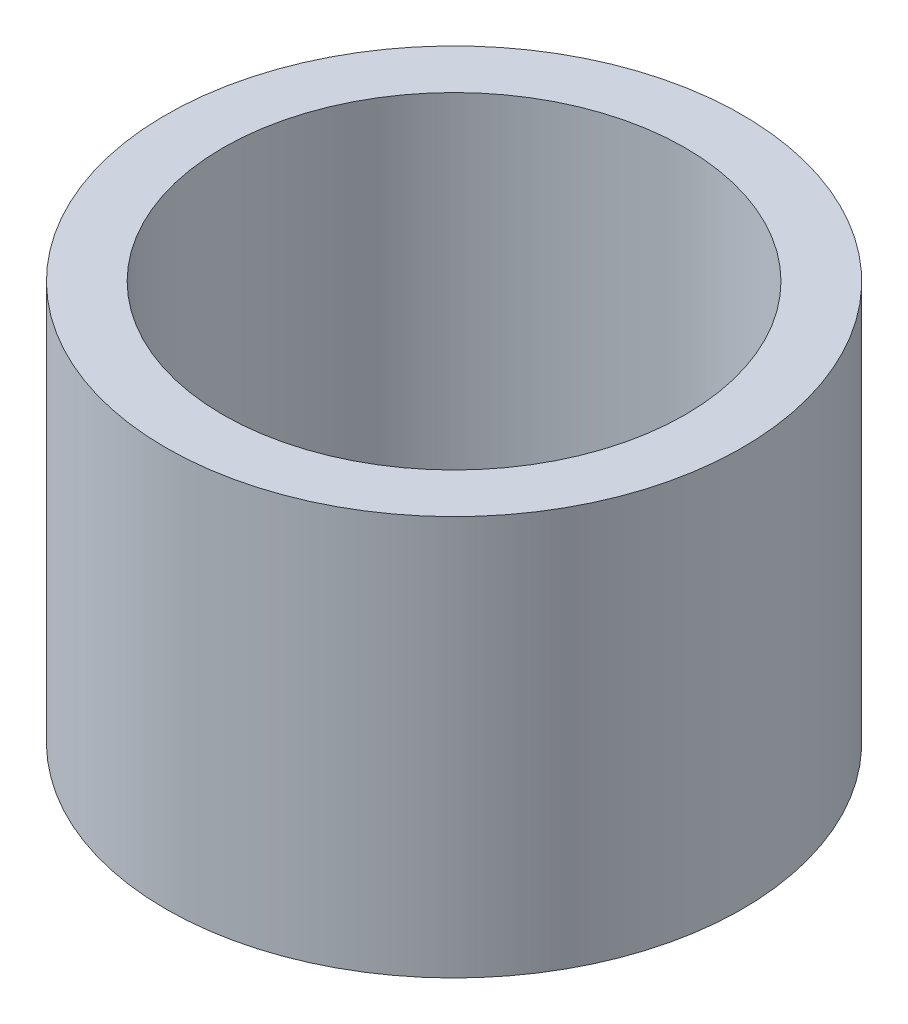
ISO-10303-21;
HEADER;
FILE_DESCRIPTION(('STEP AP214'),'2;1');
FILE_NAME('part.step','',(''),(''),'','','');
FILE_SCHEMA(('AUTOMOTIVE_DESIGN { 1 0 10303 214 1 1 1 1 }'));
ENDSEC;
DATA;
#1=APPLICATION_CONTEXT('core data for automotive mechanical design processes');
#2=APPLICATION_PROTOCOL_DEFINITION('international standard','automotive_design',2000,#1);
#3=PRODUCT_CONTEXT('',#1,'mechanical');
#4=PRODUCT('Part','Part','',(#3));
#5=PRODUCT_RELATED_PRODUCT_CATEGORY('part','',(#4));
#6=PRODUCT_DEFINITION_FORMATION('','',#4);
#7=PRODUCT_DEFINITION_CONTEXT('part definition',#1,'design');
#8=PRODUCT_DEFINITION('design','',#6,#7);
#9=PRODUCT_DEFINITION_SHAPE('','',#8);
#10=(LENGTH_UNIT() NAMED_UNIT(*) SI_UNIT(.MILLI.,.METRE.));
#11=(NAMED_UNIT(*) PLANE_ANGLE_UNIT() SI_UNIT($,.RADIAN.));
#12=(NAMED_UNIT(*) SI_UNIT($,.STERADIAN.) SOLID_ANGLE_UNIT());
#13=UNCERTAINTY_MEASURE_WITH_UNIT(LENGTH_MEASURE(1.E-05),#10,'distance_accuracy_value','');
#14=(GEOMETRIC_REPRESENTATION_CONTEXT(3) GLOBAL_UNCERTAINTY_ASSIGNED_CONTEXT((#13)) GLOBAL_UNIT_ASSIGNED_CONTEXT((#10,
#11,#12)) REPRESENTATION_CONTEXT('',''));
#15=CARTESIAN_POINT('',(0.,0.,0.));
#16=DIRECTION('',(0.,0.,1.));
#17=DIRECTION('',(1.,0.,0.));
#18=AXIS2_PLACEMENT_3D('',#15,#16,#17);
#19=CARTESIAN_POINT('',(0.,7.,0.));
#20=DIRECTION('',(0.,1.,0.));
#21=DIRECTION('',(0.,0.,1.));
#22=AXIS2_PLACEMENT_3D('',#19,#20,#21);
#23=PLANE('',#22);
#24=CARTESIAN_POINT('',(0.,7.,0.));
#25=DIRECTION('',(0.,1.,0.));
#26=DIRECTION('',(0.,0.,1.));
#27=AXIS2_PLACEMENT_3D('',#24,#25,#26);
#28=CIRCLE('',#27,5.05);
#29=CARTESIAN_POINT('',(0.,7.,5.05));
#30=VERTEX_POINT('',#29);
#31=EDGE_CURVE('E10',#30,#30,#28,.T.);
#32=ORIENTED_EDGE('',*,*,#31,.T.);
#33=EDGE_LOOP('',(#32));
#34=FACE_BOUND('',#33,.T.);
#35=CARTESIAN_POINT('',(0.,7.,0.));
#36=DIRECTION('',(0.,1.,0.));
#37=DIRECTION('',(0.,0.,1.));
#38=AXIS2_PLACEMENT_3D('',#35,#36,#37);
#39=CIRCLE('',#38,4.05);
#40=CARTESIAN_POINT('',(0.,7.,4.05));
#41=VERTEX_POINT('',#40);
#42=EDGE_CURVE('E56',#41,#41,#39,.T.);
#43=ORIENTED_EDGE('',*,*,#42,.F.);
#44=EDGE_LOOP('',(#43));
#45=FACE_BOUND('',#44,.T.);
#46=ADVANCED_FACE('F43',(#34,#45),#23,.T.);
#47=CARTESIAN_POINT('',(0.,0.,0.));
#48=DIRECTION('',(0.,1.,0.));
#49=DIRECTION('',(0.,0.,1.));
#50=AXIS2_PLACEMENT_3D('',#47,#48,#49);
#51=PLANE('',#50);
#52=CARTESIAN_POINT('',(0.,0.,0.));
#53=DIRECTION('',(0.,1.,0.));
#54=DIRECTION('',(0.,0.,1.));
#55=AXIS2_PLACEMENT_3D('',#52,#53,#54);
#56=CIRCLE('',#55,5.05);
#57=CARTESIAN_POINT('',(0.,0.,5.05));
#58=VERTEX_POINT('',#57);
#59=EDGE_CURVE('E47',#58,#58,#56,.T.);
#60=ORIENTED_EDGE('',*,*,#59,.F.);
#61=EDGE_LOOP('',(#60));
#62=FACE_BOUND('',#61,.T.);
#63=CARTESIAN_POINT('',(0.,0.,0.));
#64=DIRECTION('',(0.,1.,0.));
#65=DIRECTION('',(0.,0.,1.));
#66=AXIS2_PLACEMENT_3D('',#63,#64,#65);
#67=CIRCLE('',#66,4.05);
#68=CARTESIAN_POINT('',(0.,0.,4.05));
#69=VERTEX_POINT('',#68);
#70=EDGE_CURVE('E58',#69,#69,#67,.T.);
#71=ORIENTED_EDGE('',*,*,#70,.T.);
#72=EDGE_LOOP('',(#71));
#73=FACE_BOUND('',#72,.T.);
#74=ADVANCED_FACE('F70',(#62,#73),#51,.F.);
#75=CARTESIAN_POINT('',(0.,7.,0.));
#76=DIRECTION('',(0.,-1.,0.));
#77=DIRECTION('',(0.,0.,-1.));
#78=AXIS2_PLACEMENT_3D('',#75,#76,#77);
#79=CYLINDRICAL_SURFACE('',#78,5.05);
#80=ORIENTED_EDGE('',*,*,#31,.F.);
#81=EDGE_LOOP('',(#80));
#82=FACE_BOUND('',#81,.T.);
#83=ORIENTED_EDGE('',*,*,#59,.T.);
#84=EDGE_LOOP('',(#83));
#85=FACE_BOUND('',#84,.T.);
#86=ADVANCED_FACE('F45',(#82,#85),#79,.T.);
#87=CARTESIAN_POINT('',(0.,7.,0.));
#88=DIRECTION('',(0.,-1.,0.));
#89=DIRECTION('',(0.,0.,-1.));
#90=AXIS2_PLACEMENT_3D('',#87,#88,#89);
#91=CYLINDRICAL_SURFACE('',#90,4.05);
#92=ORIENTED_EDGE('',*,*,#42,.T.);
#93=EDGE_LOOP('',(#92));
#94=FACE_BOUND('',#93,.T.);
#95=ORIENTED_EDGE('',*,*,#70,.F.);
#96=EDGE_LOOP('',(#95));
#97=FACE_BOUND('',#96,.T.);
#98=ADVANCED_FACE('F66',(#94,#97),#91,.F.);
#99=CLOSED_SHELL('',(#46,#74,#86,#98));
#100=MANIFOLD_SOLID_BREP('B2',#99);
#101=ADVANCED_BREP_SHAPE_REPRESENTATION('',(#18,#100),#14);
#102=SHAPE_DEFINITION_REPRESENTATION(#9,#101);
ENDSEC;
END-ISO-10303-21;
